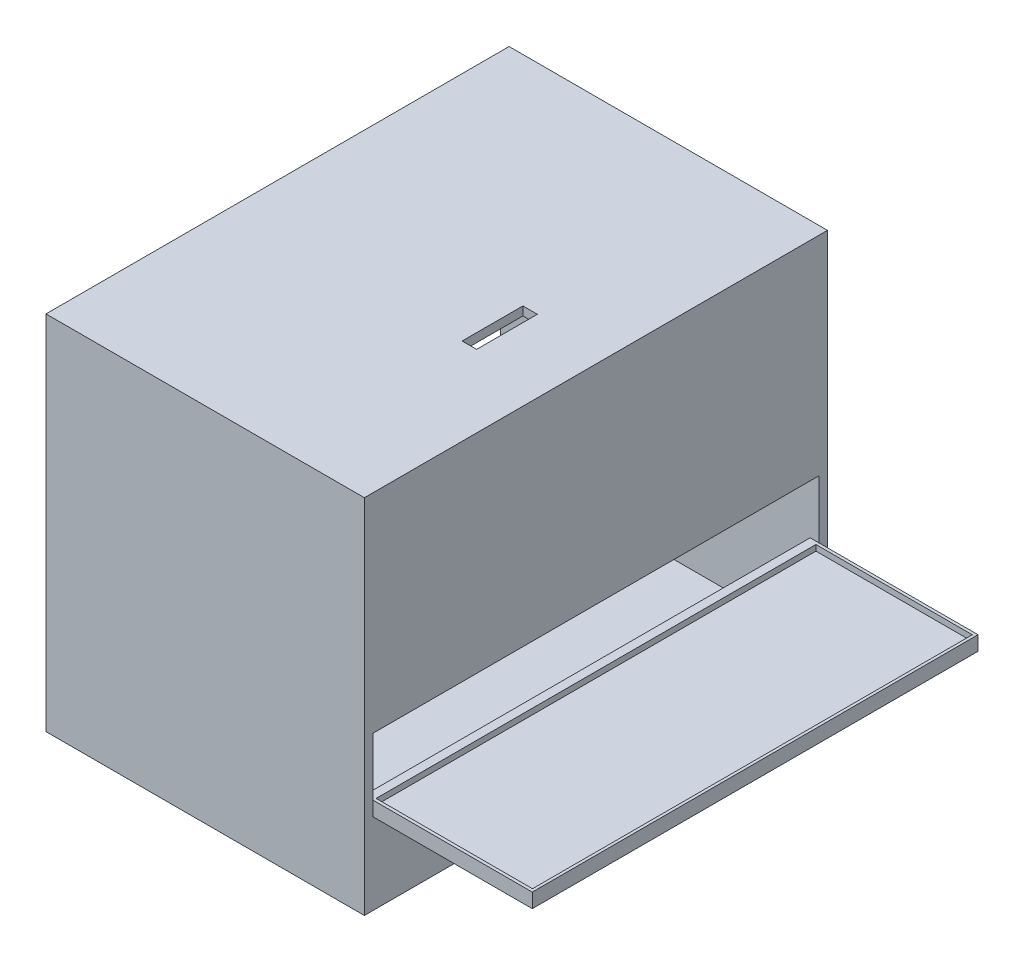
ISO-10303-21;
HEADER;
FILE_DESCRIPTION(('STEP AP214'),'2;1');
FILE_NAME('part.step','',(''),(''),'','','');
FILE_SCHEMA(('AUTOMOTIVE_DESIGN { 1 0 10303 214 1 1 1 1 }'));
ENDSEC;
DATA;
#1=APPLICATION_CONTEXT('core data for automotive mechanical design processes');
#2=APPLICATION_PROTOCOL_DEFINITION('international standard','automotive_design',2000,#1);
#3=PRODUCT_CONTEXT('',#1,'mechanical');
#4=PRODUCT('Part','Part','',(#3));
#5=PRODUCT_RELATED_PRODUCT_CATEGORY('part','',(#4));
#6=PRODUCT_DEFINITION_FORMATION('','',#4);
#7=PRODUCT_DEFINITION_CONTEXT('part definition',#1,'design');
#8=PRODUCT_DEFINITION('design','',#6,#7);
#9=PRODUCT_DEFINITION_SHAPE('','',#8);
#10=(LENGTH_UNIT() NAMED_UNIT(*) SI_UNIT(.MILLI.,.METRE.));
#11=(NAMED_UNIT(*) PLANE_ANGLE_UNIT() SI_UNIT($,.RADIAN.));
#12=(NAMED_UNIT(*) SI_UNIT($,.STERADIAN.) SOLID_ANGLE_UNIT());
#13=UNCERTAINTY_MEASURE_WITH_UNIT(LENGTH_MEASURE(1.E-05),#10,'distance_accuracy_value','');
#14=(GEOMETRIC_REPRESENTATION_CONTEXT(3) GLOBAL_UNCERTAINTY_ASSIGNED_CONTEXT((#13)) GLOBAL_UNIT_ASSIGNED_CONTEXT((#10,
#11,#12)) REPRESENTATION_CONTEXT('',''));
#15=CARTESIAN_POINT('',(0.,0.,0.));
#16=DIRECTION('',(0.,0.,1.));
#17=DIRECTION('',(1.,0.,0.));
#18=AXIS2_PLACEMENT_3D('',#15,#16,#17);
#19=CARTESIAN_POINT('',(110.,10.,-160.));
#20=DIRECTION('',(-1.,0.,0.));
#21=DIRECTION('',(0.,0.,1.));
#22=AXIS2_PLACEMENT_3D('',#19,#20,#21);
#23=PLANE('',#22);
#24=DIRECTION('',(0.,-1.,0.));
#25=VECTOR('',#24,1.);
#26=CARTESIAN_POINT('',(110.,10.,0.));
#27=LINE('',#26,#25);
#28=CARTESIAN_POINT('',(110.,130.,0.));
#29=VERTEX_POINT('',#28);
#30=CARTESIAN_POINT('',(110.,5.,0.));
#31=VERTEX_POINT('',#30);
#32=EDGE_CURVE('E424',#29,#31,#27,.T.);
#33=ORIENTED_EDGE('',*,*,#32,.T.);
#34=DIRECTION('',(0.,0.,1.));
#35=VECTOR('',#34,1.);
#36=CARTESIAN_POINT('',(110.,5.,0.));
#37=LINE('',#36,#35);
#38=CARTESIAN_POINT('',(110.,5.,-160.));
#39=VERTEX_POINT('',#38);
#40=EDGE_CURVE('E823',#39,#31,#37,.T.);
#41=ORIENTED_EDGE('',*,*,#40,.F.);
#42=DIRECTION('',(0.,-1.,0.));
#43=VECTOR('',#42,1.);
#44=CARTESIAN_POINT('',(110.,10.,-160.));
#45=LINE('',#44,#43);
#46=CARTESIAN_POINT('',(110.,130.,-160.));
#47=VERTEX_POINT('',#46);
#48=EDGE_CURVE('E420',#47,#39,#45,.T.);
#49=ORIENTED_EDGE('',*,*,#48,.F.);
#50=DIRECTION('',(0.,0.,-1.));
#51=VECTOR('',#50,1.);
#52=CARTESIAN_POINT('',(110.,130.,0.));
#53=LINE('',#52,#51);
#54=EDGE_CURVE('E357',#29,#47,#53,.T.);
#55=ORIENTED_EDGE('',*,*,#54,.F.);
#56=EDGE_LOOP('',(#33,#41,#49,#55));
#57=FACE_BOUND('',#56,.T.);
#58=DIRECTION('',(0.,1.,0.));
#59=VECTOR('',#58,1.);
#60=CARTESIAN_POINT('',(110.,58.0406305240899,-157.));
#61=LINE('',#60,#59);
#62=CARTESIAN_POINT('',(110.,38.0049075765783,-157.));
#63=VERTEX_POINT('',#62);
#64=CARTESIAN_POINT('',(110.,58.0406305240899,-157.));
#65=VERTEX_POINT('',#64);
#66=EDGE_CURVE('E265',#63,#65,#61,.T.);
#67=ORIENTED_EDGE('',*,*,#66,.F.);
#68=DIRECTION('',(0.,1.,0.));
#69=VECTOR('',#68,1.);
#70=CARTESIAN_POINT('',(110.,33.0313842492603,-157.));
#71=LINE('',#70,#69);
#72=CARTESIAN_POINT('',(110.,33.0313842492603,-157.));
#73=VERTEX_POINT('',#72);
#74=EDGE_CURVE('E234',#73,#63,#71,.T.);
#75=ORIENTED_EDGE('',*,*,#74,.F.);
#76=DIRECTION('',(0.,0.,-1.));
#77=VECTOR('',#76,1.);
#78=CARTESIAN_POINT('',(110.,33.0313842492603,-10.));
#79=LINE('',#78,#77);
#80=CARTESIAN_POINT('',(110.,33.0313842492603,-3.00000000000001));
#81=VERTEX_POINT('',#80);
#82=EDGE_CURVE('E898',#81,#73,#79,.T.);
#83=ORIENTED_EDGE('',*,*,#82,.F.);
#84=DIRECTION('',(0.,-1.,0.));
#85=VECTOR('',#84,1.);
#86=CARTESIAN_POINT('',(110.,36.0049075765782,-3.00000000000001));
#87=LINE('',#86,#85);
#88=CARTESIAN_POINT('',(110.,38.0049075765782,-3.00000000000001));
#89=VERTEX_POINT('',#88);
#90=EDGE_CURVE('E244',#89,#81,#87,.T.);
#91=ORIENTED_EDGE('',*,*,#90,.F.);
#92=DIRECTION('',(0.,-1.,0.));
#93=VECTOR('',#92,1.);
#94=CARTESIAN_POINT('',(110.,38.0049075765782,-3.00000000000002));
#95=LINE('',#94,#93);
#96=CARTESIAN_POINT('',(110.,58.0406305240899,-3.00000000000002));
#97=VERTEX_POINT('',#96);
#98=EDGE_CURVE('E843',#97,#89,#95,.T.);
#99=ORIENTED_EDGE('',*,*,#98,.F.);
#100=DIRECTION('',(0.,0.,-1.));
#101=VECTOR('',#100,1.);
#102=CARTESIAN_POINT('',(110.,58.0406305240899,-160.));
#103=LINE('',#102,#101);
#104=EDGE_CURVE('E273',#97,#65,#103,.T.);
#105=ORIENTED_EDGE('',*,*,#104,.T.);
#106=EDGE_LOOP('',(#67,#75,#83,#91,#99,#105));
#107=FACE_BOUND('',#106,.T.);
#108=ADVANCED_FACE('F41',(#57,#107),#23,.F.);
#109=DIRECTION('',(0.,-1.,0.));
#110=VECTOR('',#109,1.);
#111=CARTESIAN_POINT('',(110.,38.0049075765783,-156.007066327625));
#112=LINE('',#111,#110);
#113=CARTESIAN_POINT('',(110.,38.0049075765783,-156.007066327625));
#114=VERTEX_POINT('',#113);
#115=CARTESIAN_POINT('',(110.,36.0049075765783,-156.007066327625));
#116=VERTEX_POINT('',#115);
#117=EDGE_CURVE('E919',#114,#116,#112,.T.);
#118=ORIENTED_EDGE('',*,*,#117,.F.);
#119=DIRECTION('',(0.,0.,1.));
#120=VECTOR('',#119,1.);
#121=CARTESIAN_POINT('',(110.,38.0049075765783,-150.));
#122=LINE('',#121,#120);
#123=CARTESIAN_POINT('',(110.,38.0049075765782,-4.05001981175701));
#124=VERTEX_POINT('',#123);
#125=EDGE_CURVE('E361',#114,#124,#122,.T.);
#126=ORIENTED_EDGE('',*,*,#125,.T.);
#127=DIRECTION('',(0.,-1.,0.));
#128=VECTOR('',#127,1.);
#129=CARTESIAN_POINT('',(110.,38.0049075765782,-4.05001981175701));
#130=LINE('',#129,#128);
#131=CARTESIAN_POINT('',(110.,36.0049075765782,-4.05001981175701));
#132=VERTEX_POINT('',#131);
#133=EDGE_CURVE('E930',#124,#132,#130,.T.);
#134=ORIENTED_EDGE('',*,*,#133,.T.);
#135=DIRECTION('',(0.,0.,1.));
#136=VECTOR('',#135,1.);
#137=CARTESIAN_POINT('',(110.,36.0049075765783,-150.));
#138=LINE('',#137,#136);
#139=EDGE_CURVE('E362',#116,#132,#138,.T.);
#140=ORIENTED_EDGE('',*,*,#139,.F.);
#141=EDGE_LOOP('',(#118,#126,#134,#140));
#142=FACE_BOUND('',#141,.T.);
#143=ADVANCED_FACE('F463',(#142),#23,.F.);
#144=CARTESIAN_POINT('',(0.,36.0049075765782,0.));
#145=DIRECTION('',(0.,1.,0.));
#146=DIRECTION('',(0.,0.,1.));
#147=AXIS2_PLACEMENT_3D('',#144,#145,#146);
#148=PLANE('',#147);
#149=DIRECTION('',(0.,0.,1.));
#150=VECTOR('',#149,1.);
#151=CARTESIAN_POINT('',(164.030852529379,36.0049075765783,-156.007066327625));
#152=LINE('',#151,#150);
#153=CARTESIAN_POINT('',(164.030852529379,36.0049075765783,-156.007066327625));
#154=VERTEX_POINT('',#153);
#155=CARTESIAN_POINT('',(164.030852529379,36.0049075765782,-4.05001981175701));
#156=VERTEX_POINT('',#155);
#157=EDGE_CURVE('E936',#154,#156,#152,.T.);
#158=ORIENTED_EDGE('',*,*,#157,.F.);
#159=DIRECTION('',(1.,0.,0.));
#160=VECTOR('',#159,1.);
#161=CARTESIAN_POINT('',(110.,36.0049075765783,-156.007066327625));
#162=LINE('',#161,#160);
#163=EDGE_CURVE('E939',#116,#154,#162,.T.);
#164=ORIENTED_EDGE('',*,*,#163,.F.);
#165=ORIENTED_EDGE('',*,*,#139,.T.);
#166=DIRECTION('',(-1.,0.,0.));
#167=VECTOR('',#166,1.);
#168=CARTESIAN_POINT('',(164.030852529379,36.0049075765782,-4.05001981175701));
#169=LINE('',#168,#167);
#170=EDGE_CURVE('E258',#156,#132,#169,.T.);
#171=ORIENTED_EDGE('',*,*,#170,.F.);
#172=EDGE_LOOP('',(#158,#164,#165,#171));
#173=FACE_BOUND('',#172,.T.);
#174=ADVANCED_FACE('F468',(#173),#148,.T.);
#175=CARTESIAN_POINT('',(165.,0.,0.));
#176=DIRECTION('',(1.,0.,0.));
#177=DIRECTION('',(0.,0.,-1.));
#178=AXIS2_PLACEMENT_3D('',#175,#176,#177);
#179=PLANE('',#178);
#180=DIRECTION('',(0.,-1.,0.));
#181=VECTOR('',#180,1.);
#182=CARTESIAN_POINT('',(165.,36.0049075765783,-157.));
#183=LINE('',#182,#181);
#184=CARTESIAN_POINT('',(165.,38.0049075765783,-157.));
#185=VERTEX_POINT('',#184);
#186=CARTESIAN_POINT('',(165.,33.0313842492603,-157.));
#187=VERTEX_POINT('',#186);
#188=EDGE_CURVE('E916',#185,#187,#183,.T.);
#189=ORIENTED_EDGE('',*,*,#188,.F.);
#190=DIRECTION('',(0.,0.,-1.));
#191=VECTOR('',#190,1.);
#192=CARTESIAN_POINT('',(165.,38.0049075765782,-3.00000000000001));
#193=LINE('',#192,#191);
#194=CARTESIAN_POINT('',(165.,38.0049075765782,-3.00000000000001));
#195=VERTEX_POINT('',#194);
#196=EDGE_CURVE('E255',#195,#185,#193,.T.);
#197=ORIENTED_EDGE('',*,*,#196,.F.);
#198=DIRECTION('',(0.,1.,0.));
#199=VECTOR('',#198,1.);
#200=CARTESIAN_POINT('',(165.,33.0313842492603,-3.00000000000001));
#201=LINE('',#200,#199);
#202=CARTESIAN_POINT('',(165.,33.0313842492603,-3.00000000000001));
#203=VERTEX_POINT('',#202);
#204=EDGE_CURVE('E904',#203,#195,#201,.T.);
#205=ORIENTED_EDGE('',*,*,#204,.F.);
#206=DIRECTION('',(0.,0.,1.));
#207=VECTOR('',#206,1.);
#208=CARTESIAN_POINT('',(165.,33.0313842492603,-150.));
#209=LINE('',#208,#207);
#210=EDGE_CURVE('E901',#187,#203,#209,.T.);
#211=ORIENTED_EDGE('',*,*,#210,.F.);
#212=EDGE_LOOP('',(#189,#197,#205,#211));
#213=FACE_BOUND('',#212,.T.);
#214=ADVANCED_FACE('F504',(#213),#179,.T.);
#215=CARTESIAN_POINT('',(132.5,38.0049075765782,-10.));
#216=DIRECTION('',(0.,-1.,0.));
#217=DIRECTION('',(0.,0.,-1.));
#218=AXIS2_PLACEMENT_3D('',#215,#216,#217);
#219=PLANE('',#218);
#220=ORIENTED_EDGE('',*,*,#125,.F.);
#221=DIRECTION('',(1.,0.,0.));
#222=VECTOR('',#221,1.);
#223=CARTESIAN_POINT('',(110.,38.0049075765783,-156.007066327625));
#224=LINE('',#223,#222);
#225=CARTESIAN_POINT('',(164.030852529379,38.0049075765783,-156.007066327625));
#226=VERTEX_POINT('',#225);
#227=EDGE_CURVE('E257',#114,#226,#224,.T.);
#228=ORIENTED_EDGE('',*,*,#227,.T.);
#229=DIRECTION('',(0.,0.,1.));
#230=VECTOR('',#229,1.);
#231=CARTESIAN_POINT('',(164.030852529379,38.0049075765783,-156.007066327625));
#232=LINE('',#231,#230);
#233=CARTESIAN_POINT('',(164.030852529379,38.0049075765782,-4.05001981175701));
#234=VERTEX_POINT('',#233);
#235=EDGE_CURVE('E950',#226,#234,#232,.T.);
#236=ORIENTED_EDGE('',*,*,#235,.T.);
#237=DIRECTION('',(-1.,0.,0.));
#238=VECTOR('',#237,1.);
#239=CARTESIAN_POINT('',(164.030852529379,38.0049075765782,-4.05001981175701));
#240=LINE('',#239,#238);
#241=EDGE_CURVE('E947',#234,#124,#240,.T.);
#242=ORIENTED_EDGE('',*,*,#241,.T.);
#243=EDGE_LOOP('',(#220,#228,#236,#242));
#244=FACE_BOUND('',#243,.T.);
#245=DIRECTION('',(0.,0.,-1.));
#246=VECTOR('',#245,1.);
#247=CARTESIAN_POINT('',(107.,38.0049075765782,-10.));
#248=LINE('',#247,#246);
#249=CARTESIAN_POINT('',(107.,38.0049075765782,-3.00000000000002));
#250=VERTEX_POINT('',#249);
#251=CARTESIAN_POINT('',(107.,38.0049075765783,-157.));
#252=VERTEX_POINT('',#251);
#253=EDGE_CURVE('E815',#250,#252,#248,.T.);
#254=ORIENTED_EDGE('',*,*,#253,.F.);
#255=DIRECTION('',(-1.,0.,0.));
#256=VECTOR('',#255,1.);
#257=CARTESIAN_POINT('',(102.5,38.0049075765782,-3.00000000000002));
#258=LINE('',#257,#256);
#259=EDGE_CURVE('E847',#89,#250,#258,.T.);
#260=ORIENTED_EDGE('',*,*,#259,.F.);
#261=DIRECTION('',(1.,0.,0.));
#262=VECTOR('',#261,1.);
#263=CARTESIAN_POINT('',(110.,38.0049075765782,-3.00000000000001));
#264=LINE('',#263,#262);
#265=EDGE_CURVE('E944',#89,#195,#264,.T.);
#266=ORIENTED_EDGE('',*,*,#265,.T.);
#267=ORIENTED_EDGE('',*,*,#196,.T.);
#268=DIRECTION('',(-1.,0.,0.));
#269=VECTOR('',#268,1.);
#270=CARTESIAN_POINT('',(165.,38.0049075765783,-157.));
#271=LINE('',#270,#269);
#272=EDGE_CURVE('E238',#185,#63,#271,.T.);
#273=ORIENTED_EDGE('',*,*,#272,.T.);
#274=DIRECTION('',(1.,0.,0.));
#275=VECTOR('',#274,1.);
#276=CARTESIAN_POINT('',(110.,38.0049075765783,-157.));
#277=LINE('',#276,#275);
#278=EDGE_CURVE('E252',#252,#63,#277,.T.);
#279=ORIENTED_EDGE('',*,*,#278,.F.);
#280=EDGE_LOOP('',(#254,#260,#266,#267,#273,#279));
#281=FACE_BOUND('',#280,.T.);
#282=ADVANCED_FACE('F251',(#244,#281),#219,.F.);
#283=CARTESIAN_POINT('',(132.5,58.0406305240899,-150.));
#284=DIRECTION('',(0.,1.,0.));
#285=DIRECTION('',(0.,0.,1.));
#286=AXIS2_PLACEMENT_3D('',#283,#284,#285);
#287=PLANE('',#286);
#288=DIRECTION('',(0.,0.,1.));
#289=VECTOR('',#288,1.);
#290=CARTESIAN_POINT('',(107.,58.0406305240899,-150.));
#291=LINE('',#290,#289);
#292=CARTESIAN_POINT('',(107.,58.0406305240899,-157.));
#293=VERTEX_POINT('',#292);
#294=CARTESIAN_POINT('',(107.,58.0406305240899,-3.00000000000002));
#295=VERTEX_POINT('',#294);
#296=EDGE_CURVE('E824',#293,#295,#291,.T.);
#297=ORIENTED_EDGE('',*,*,#296,.F.);
#298=DIRECTION('',(-1.,0.,0.));
#299=VECTOR('',#298,1.);
#300=CARTESIAN_POINT('',(102.5,58.0406305240899,-157.));
#301=LINE('',#300,#299);
#302=EDGE_CURVE('E276',#65,#293,#301,.T.);
#303=ORIENTED_EDGE('',*,*,#302,.F.);
#304=ORIENTED_EDGE('',*,*,#104,.F.);
#305=DIRECTION('',(1.,0.,0.));
#306=VECTOR('',#305,1.);
#307=CARTESIAN_POINT('',(110.,58.0406305240899,-3.00000000000002));
#308=LINE('',#307,#306);
#309=EDGE_CURVE('E840',#295,#97,#308,.T.);
#310=ORIENTED_EDGE('',*,*,#309,.F.);
#311=EDGE_LOOP('',(#297,#303,#304,#310));
#312=FACE_BOUND('',#311,.T.);
#313=ADVANCED_FACE('F451',(#312),#287,.F.);
#314=CARTESIAN_POINT('',(85.,121.,-84.7635613183249));
#315=DIRECTION('',(1.,0.,0.));
#316=DIRECTION('',(0.,0.,-1.));
#317=AXIS2_PLACEMENT_3D('',#314,#315,#316);
#318=PLANE('',#317);
#319=DIRECTION('',(0.,0.,-1.));
#320=VECTOR('',#319,1.);
#321=CARTESIAN_POINT('',(85.,127.,-84.7635613183249));
#322=LINE('',#321,#320);
#323=CARTESIAN_POINT('',(85.,127.,-63.7635613183249));
#324=VERTEX_POINT('',#323);
#325=CARTESIAN_POINT('',(85.,127.,-84.7635613183249));
#326=VERTEX_POINT('',#325);
#327=EDGE_CURVE('E65',#324,#326,#322,.T.);
#328=ORIENTED_EDGE('',*,*,#327,.F.);
#329=DIRECTION('',(0.,1.,0.));
#330=VECTOR('',#329,1.);
#331=CARTESIAN_POINT('',(85.,121.,-63.7635613183249));
#332=LINE('',#331,#330);
#333=CARTESIAN_POINT('',(85.,130.,-63.7635613183249));
#334=VERTEX_POINT('',#333);
#335=EDGE_CURVE('E334',#324,#334,#332,.T.);
#336=ORIENTED_EDGE('',*,*,#335,.T.);
#337=DIRECTION('',(0.,0.,-1.));
#338=VECTOR('',#337,1.);
#339=CARTESIAN_POINT('',(85.,130.,-84.7635613183249));
#340=LINE('',#339,#338);
#341=CARTESIAN_POINT('',(85.,130.,-84.7635613183249));
#342=VERTEX_POINT('',#341);
#343=EDGE_CURVE('E317',#334,#342,#340,.T.);
#344=ORIENTED_EDGE('',*,*,#343,.T.);
#345=DIRECTION('',(0.,1.,0.));
#346=VECTOR('',#345,1.);
#347=CARTESIAN_POINT('',(85.,121.,-84.7635613183249));
#348=LINE('',#347,#346);
#349=EDGE_CURVE('E333',#326,#342,#348,.T.);
#350=ORIENTED_EDGE('',*,*,#349,.F.);
#351=EDGE_LOOP('',(#328,#336,#344,#350));
#352=FACE_BOUND('',#351,.T.);
#353=ADVANCED_FACE('F449',(#352),#318,.F.);
#354=CARTESIAN_POINT('',(85.,121.,-63.7635613183249));
#355=DIRECTION('',(0.,0.,1.));
#356=DIRECTION('',(1.,0.,0.));
#357=AXIS2_PLACEMENT_3D('',#354,#355,#356);
#358=PLANE('',#357);
#359=DIRECTION('',(1.,0.,0.));
#360=VECTOR('',#359,1.);
#361=CARTESIAN_POINT('',(85.,127.,-63.7635613183249));
#362=LINE('',#361,#360);
#363=CARTESIAN_POINT('',(80.,127.,-63.7635613183249));
#364=VERTEX_POINT('',#363);
#365=EDGE_CURVE('E312',#364,#324,#362,.T.);
#366=ORIENTED_EDGE('',*,*,#365,.F.);
#367=DIRECTION('',(0.,1.,0.));
#368=VECTOR('',#367,1.);
#369=CARTESIAN_POINT('',(80.,121.,-63.7635613183249));
#370=LINE('',#369,#368);
#371=CARTESIAN_POINT('',(80.,130.,-63.7635613183249));
#372=VERTEX_POINT('',#371);
#373=EDGE_CURVE('E338',#364,#372,#370,.T.);
#374=ORIENTED_EDGE('',*,*,#373,.T.);
#375=DIRECTION('',(1.,0.,0.));
#376=VECTOR('',#375,1.);
#377=CARTESIAN_POINT('',(85.,130.,-63.7635613183249));
#378=LINE('',#377,#376);
#379=EDGE_CURVE('E329',#372,#334,#378,.T.);
#380=ORIENTED_EDGE('',*,*,#379,.T.);
#381=ORIENTED_EDGE('',*,*,#335,.F.);
#382=EDGE_LOOP('',(#366,#374,#380,#381));
#383=FACE_BOUND('',#382,.T.);
#384=ADVANCED_FACE('F447',(#383),#358,.F.);
#385=CARTESIAN_POINT('',(80.,121.,-63.7635613183249));
#386=DIRECTION('',(-1.,0.,0.));
#387=DIRECTION('',(0.,0.,1.));
#388=AXIS2_PLACEMENT_3D('',#385,#386,#387);
#389=PLANE('',#388);
#390=DIRECTION('',(0.,0.,1.));
#391=VECTOR('',#390,1.);
#392=CARTESIAN_POINT('',(80.,127.,-63.7635613183249));
#393=LINE('',#392,#391);
#394=CARTESIAN_POINT('',(80.,127.,-84.7635613183249));
#395=VERTEX_POINT('',#394);
#396=EDGE_CURVE('E309',#395,#364,#393,.T.);
#397=ORIENTED_EDGE('',*,*,#396,.F.);
#398=DIRECTION('',(0.,1.,0.));
#399=VECTOR('',#398,1.);
#400=CARTESIAN_POINT('',(80.,121.,-84.7635613183249));
#401=LINE('',#400,#399);
#402=CARTESIAN_POINT('',(80.,130.,-84.7635613183249));
#403=VERTEX_POINT('',#402);
#404=EDGE_CURVE('E341',#395,#403,#401,.T.);
#405=ORIENTED_EDGE('',*,*,#404,.T.);
#406=DIRECTION('',(0.,0.,1.));
#407=VECTOR('',#406,1.);
#408=CARTESIAN_POINT('',(80.,130.,-63.7635613183249));
#409=LINE('',#408,#407);
#410=EDGE_CURVE('E325',#403,#372,#409,.T.);
#411=ORIENTED_EDGE('',*,*,#410,.T.);
#412=ORIENTED_EDGE('',*,*,#373,.F.);
#413=EDGE_LOOP('',(#397,#405,#411,#412));
#414=FACE_BOUND('',#413,.T.);
#415=ADVANCED_FACE('F436',(#414),#389,.F.);
#416=CARTESIAN_POINT('',(80.,121.,-84.7635613183249));
#417=DIRECTION('',(0.,0.,-1.));
#418=DIRECTION('',(-1.,0.,0.));
#419=AXIS2_PLACEMENT_3D('',#416,#417,#418);
#420=PLANE('',#419);
#421=DIRECTION('',(-1.,0.,0.));
#422=VECTOR('',#421,1.);
#423=CARTESIAN_POINT('',(80.,127.,-84.7635613183249));
#424=LINE('',#423,#422);
#425=EDGE_CURVE('E50',#326,#395,#424,.T.);
#426=ORIENTED_EDGE('',*,*,#425,.F.);
#427=ORIENTED_EDGE('',*,*,#349,.T.);
#428=DIRECTION('',(-1.,0.,0.));
#429=VECTOR('',#428,1.);
#430=CARTESIAN_POINT('',(80.,130.,-84.7635613183249));
#431=LINE('',#430,#429);
#432=EDGE_CURVE('E321',#342,#403,#431,.T.);
#433=ORIENTED_EDGE('',*,*,#432,.T.);
#434=ORIENTED_EDGE('',*,*,#404,.F.);
#435=EDGE_LOOP('',(#426,#427,#433,#434));
#436=FACE_BOUND('',#435,.T.);
#437=ADVANCED_FACE('F437',(#436),#420,.F.);
#438=CARTESIAN_POINT('',(0.,10.,0.));
#439=DIRECTION('',(0.,-1.,0.));
#440=DIRECTION('',(0.,0.,-1.));
#441=AXIS2_PLACEMENT_3D('',#438,#439,#440);
#442=PLANE('',#441);
#443=DIRECTION('',(0.,0.,1.));
#444=VECTOR('',#443,1.);
#445=CARTESIAN_POINT('',(0.,10.,0.));
#446=LINE('',#445,#444);
#447=CARTESIAN_POINT('',(0.,10.,-157.));
#448=VERTEX_POINT('',#447);
#449=CARTESIAN_POINT('',(0.,10.,-3.));
#450=VERTEX_POINT('',#449);
#451=EDGE_CURVE('E407',#448,#450,#446,.T.);
#452=ORIENTED_EDGE('',*,*,#451,.T.);
#453=DIRECTION('',(-1.,0.,0.));
#454=VECTOR('',#453,1.);
#455=CARTESIAN_POINT('',(0.,10.,-3.));
#456=LINE('',#455,#454);
#457=CARTESIAN_POINT('',(7.50000000000001,10.,-3.00000000000001));
#458=VERTEX_POINT('',#457);
#459=EDGE_CURVE('E858',#458,#450,#456,.T.);
#460=ORIENTED_EDGE('',*,*,#459,.F.);
#461=DIRECTION('',(0.,0.,1.));
#462=VECTOR('',#461,1.);
#463=CARTESIAN_POINT('',(7.5,10.,-150.));
#464=LINE('',#463,#462);
#465=CARTESIAN_POINT('',(7.5,10.,-157.));
#466=VERTEX_POINT('',#465);
#467=EDGE_CURVE('E392',#466,#458,#464,.T.);
#468=ORIENTED_EDGE('',*,*,#467,.F.);
#469=DIRECTION('',(1.,0.,0.));
#470=VECTOR('',#469,1.);
#471=CARTESIAN_POINT('',(7.5,10.,-157.));
#472=LINE('',#471,#470);
#473=EDGE_CURVE('E290',#448,#466,#472,.T.);
#474=ORIENTED_EDGE('',*,*,#473,.F.);
#475=EDGE_LOOP('',(#452,#460,#468,#474));
#476=FACE_BOUND('',#475,.T.);
#477=ADVANCED_FACE('F480',(#476),#442,.F.);
#478=CARTESIAN_POINT('',(110.,10.,0.));
#479=DIRECTION('',(0.,0.,-1.));
#480=DIRECTION('',(-1.,0.,0.));
#481=AXIS2_PLACEMENT_3D('',#478,#479,#480);
#482=PLANE('',#481);
#483=DIRECTION('',(0.,-1.,0.));
#484=VECTOR('',#483,1.);
#485=CARTESIAN_POINT('',(0.,10.,0.));
#486=LINE('',#485,#484);
#487=CARTESIAN_POINT('',(0.,130.,0.));
#488=VERTEX_POINT('',#487);
#489=CARTESIAN_POINT('',(0.,5.,0.));
#490=VERTEX_POINT('',#489);
#491=EDGE_CURVE('E412',#488,#490,#486,.T.);
#492=ORIENTED_EDGE('',*,*,#491,.T.);
#493=DIRECTION('',(-1.,0.,0.));
#494=VECTOR('',#493,1.);
#495=CARTESIAN_POINT('',(0.,5.,0.));
#496=LINE('',#495,#494);
#497=EDGE_CURVE('E57',#31,#490,#496,.T.);
#498=ORIENTED_EDGE('',*,*,#497,.F.);
#499=ORIENTED_EDGE('',*,*,#32,.F.);
#500=DIRECTION('',(1.,0.,0.));
#501=VECTOR('',#500,1.);
#502=CARTESIAN_POINT('',(0.,130.,0.));
#503=LINE('',#502,#501);
#504=EDGE_CURVE('E353',#488,#29,#503,.T.);
#505=ORIENTED_EDGE('',*,*,#504,.F.);
#506=EDGE_LOOP('',(#492,#498,#499,#505));
#507=FACE_BOUND('',#506,.T.);
#508=ADVANCED_FACE('F43',(#507),#482,.F.);
#509=CARTESIAN_POINT('',(0.,10.,-160.));
#510=DIRECTION('',(0.,0.,1.));
#511=DIRECTION('',(1.,0.,0.));
#512=AXIS2_PLACEMENT_3D('',#509,#510,#511);
#513=PLANE('',#512);
#514=DIRECTION('',(0.,-1.,0.));
#515=VECTOR('',#514,1.);
#516=CARTESIAN_POINT('',(32.5189069026237,8.,-160.));
#517=LINE('',#516,#515);
#518=CARTESIAN_POINT('',(32.5189069026237,28.,-160.));
#519=VERTEX_POINT('',#518);
#520=CARTESIAN_POINT('',(32.5189069026237,8.,-160.));
#521=VERTEX_POINT('',#520);
#522=EDGE_CURVE('E383',#519,#521,#517,.T.);
#523=ORIENTED_EDGE('',*,*,#522,.T.);
#524=DIRECTION('',(1.,0.,0.));
#525=VECTOR('',#524,1.);
#526=CARTESIAN_POINT('',(57.5224838599269,8.,-160.));
#527=LINE('',#526,#525);
#528=CARTESIAN_POINT('',(57.5224838599269,8.,-160.));
#529=VERTEX_POINT('',#528);
#530=EDGE_CURVE('E371',#521,#529,#527,.T.);
#531=ORIENTED_EDGE('',*,*,#530,.T.);
#532=DIRECTION('',(0.,1.,0.));
#533=VECTOR('',#532,1.);
#534=CARTESIAN_POINT('',(57.5224838599269,28.,-160.));
#535=LINE('',#534,#533);
#536=CARTESIAN_POINT('',(57.5224838599269,28.,-160.));
#537=VERTEX_POINT('',#536);
#538=EDGE_CURVE('E375',#529,#537,#535,.T.);
#539=ORIENTED_EDGE('',*,*,#538,.T.);
#540=DIRECTION('',(-1.,0.,0.));
#541=VECTOR('',#540,1.);
#542=CARTESIAN_POINT('',(32.5189069026237,28.,-160.));
#543=LINE('',#542,#541);
#544=EDGE_CURVE('E379',#537,#519,#543,.T.);
#545=ORIENTED_EDGE('',*,*,#544,.T.);
#546=EDGE_LOOP('',(#523,#531,#539,#545));
#547=FACE_BOUND('',#546,.T.);
#548=ORIENTED_EDGE('',*,*,#48,.T.);
#549=DIRECTION('',(1.,0.,0.));
#550=VECTOR('',#549,1.);
#551=CARTESIAN_POINT('',(110.,5.,-160.));
#552=LINE('',#551,#550);
#553=CARTESIAN_POINT('',(0.,5.,-160.));
#554=VERTEX_POINT('',#553);
#555=EDGE_CURVE('E837',#554,#39,#552,.T.);
#556=ORIENTED_EDGE('',*,*,#555,.F.);
#557=DIRECTION('',(0.,-1.,0.));
#558=VECTOR('',#557,1.);
#559=CARTESIAN_POINT('',(0.,10.,-160.));
#560=LINE('',#559,#558);
#561=CARTESIAN_POINT('',(0.,130.,-160.));
#562=VERTEX_POINT('',#561);
#563=EDGE_CURVE('E416',#562,#554,#560,.T.);
#564=ORIENTED_EDGE('',*,*,#563,.F.);
#565=DIRECTION('',(-1.,0.,0.));
#566=VECTOR('',#565,1.);
#567=CARTESIAN_POINT('',(110.,130.,-160.));
#568=LINE('',#567,#566);
#569=EDGE_CURVE('E337',#47,#562,#568,.T.);
#570=ORIENTED_EDGE('',*,*,#569,.F.);
#571=EDGE_LOOP('',(#548,#556,#564,#570));
#572=FACE_BOUND('',#571,.T.);
#573=ADVANCED_FACE('F471',(#547,#572),#513,.F.);
#574=CARTESIAN_POINT('',(0.,10.,0.));
#575=DIRECTION('',(1.,0.,0.));
#576=DIRECTION('',(0.,0.,-1.));
#577=AXIS2_PLACEMENT_3D('',#574,#575,#576);
#578=PLANE('',#577);
#579=DIRECTION('',(0.,0.,-1.));
#580=VECTOR('',#579,1.);
#581=CARTESIAN_POINT('',(0.,127.,-10.));
#582=LINE('',#581,#580);
#583=CARTESIAN_POINT('',(0.,127.,-3.));
#584=VERTEX_POINT('',#583);
#585=CARTESIAN_POINT('',(0.,127.,-157.));
#586=VERTEX_POINT('',#585);
#587=EDGE_CURVE('E306',#584,#586,#582,.T.);
#588=ORIENTED_EDGE('',*,*,#587,.F.);
#589=DIRECTION('',(0.,1.,0.));
#590=VECTOR('',#589,1.);
#591=CARTESIAN_POINT('',(0.,127.,-3.));
#592=LINE('',#591,#590);
#593=EDGE_CURVE('E862',#450,#584,#592,.T.);
#594=ORIENTED_EDGE('',*,*,#593,.F.);
#595=ORIENTED_EDGE('',*,*,#451,.F.);
#596=DIRECTION('',(0.,-1.,0.));
#597=VECTOR('',#596,1.);
#598=CARTESIAN_POINT('',(0.,10.,-157.));
#599=LINE('',#598,#597);
#600=EDGE_CURVE('E286',#586,#448,#599,.T.);
#601=ORIENTED_EDGE('',*,*,#600,.F.);
#602=EDGE_LOOP('',(#588,#594,#595,#601));
#603=FACE_BOUND('',#602,.T.);
#604=ORIENTED_EDGE('',*,*,#563,.T.);
#605=DIRECTION('',(0.,0.,-1.));
#606=VECTOR('',#605,1.);
#607=CARTESIAN_POINT('',(0.,5.,-160.));
#608=LINE('',#607,#606);
#609=EDGE_CURVE('E834',#490,#554,#608,.T.);
#610=ORIENTED_EDGE('',*,*,#609,.F.);
#611=ORIENTED_EDGE('',*,*,#491,.F.);
#612=DIRECTION('',(0.,0.,1.));
#613=VECTOR('',#612,1.);
#614=CARTESIAN_POINT('',(0.,130.,-160.));
#615=LINE('',#614,#613);
#616=EDGE_CURVE('E349',#562,#488,#615,.T.);
#617=ORIENTED_EDGE('',*,*,#616,.F.);
#618=EDGE_LOOP('',(#604,#610,#611,#617));
#619=FACE_BOUND('',#618,.T.);
#620=ADVANCED_FACE('F474',(#603,#619),#578,.F.);
#621=CARTESIAN_POINT('',(7.5,8.,-150.));
#622=DIRECTION('',(-1.,0.,0.));
#623=DIRECTION('',(0.,0.,1.));
#624=AXIS2_PLACEMENT_3D('',#621,#622,#623);
#625=PLANE('',#624);
#626=ORIENTED_EDGE('',*,*,#467,.T.);
#627=DIRECTION('',(0.,1.,0.));
#628=VECTOR('',#627,1.);
#629=CARTESIAN_POINT('',(7.50000000000001,10.,-3.00000000000001));
#630=LINE('',#629,#628);
#631=CARTESIAN_POINT('',(7.5,8.,-3.00000000000001));
#632=VERTEX_POINT('',#631);
#633=EDGE_CURVE('E854',#632,#458,#630,.T.);
#634=ORIENTED_EDGE('',*,*,#633,.F.);
#635=DIRECTION('',(0.,0.,1.));
#636=VECTOR('',#635,1.);
#637=CARTESIAN_POINT('',(7.5,8.,-150.));
#638=LINE('',#637,#636);
#639=CARTESIAN_POINT('',(7.5,8.,-157.));
#640=VERTEX_POINT('',#639);
#641=EDGE_CURVE('E404',#640,#632,#638,.T.);
#642=ORIENTED_EDGE('',*,*,#641,.F.);
#643=DIRECTION('',(0.,-1.,0.));
#644=VECTOR('',#643,1.);
#645=CARTESIAN_POINT('',(7.5,8.,-157.));
#646=LINE('',#645,#644);
#647=EDGE_CURVE('E294',#466,#640,#646,.T.);
#648=ORIENTED_EDGE('',*,*,#647,.F.);
#649=EDGE_LOOP('',(#626,#634,#642,#648));
#650=FACE_BOUND('',#649,.T.);
#651=ADVANCED_FACE('F478',(#650),#625,.F.);
#652=CARTESIAN_POINT('',(0.,8.,0.));
#653=DIRECTION('',(0.,1.,0.));
#654=DIRECTION('',(0.,0.,1.));
#655=AXIS2_PLACEMENT_3D('',#652,#653,#654);
#656=PLANE('',#655);
#657=DIRECTION('',(0.,0.,1.));
#658=VECTOR('',#657,1.);
#659=CARTESIAN_POINT('',(32.5189069026237,8.,-160.));
#660=LINE('',#659,#658);
#661=CARTESIAN_POINT('',(32.5189069026237,8.,-157.));
#662=VERTEX_POINT('',#661);
#663=EDGE_CURVE('E388',#521,#662,#660,.T.);
#664=ORIENTED_EDGE('',*,*,#663,.T.);
#665=DIRECTION('',(1.,0.,0.));
#666=VECTOR('',#665,1.);
#667=CARTESIAN_POINT('',(102.5,8.,-157.));
#668=LINE('',#667,#666);
#669=EDGE_CURVE('E269',#640,#662,#668,.T.);
#670=ORIENTED_EDGE('',*,*,#669,.F.);
#671=ORIENTED_EDGE('',*,*,#641,.T.);
#672=DIRECTION('',(-1.,0.,0.));
#673=VECTOR('',#672,1.);
#674=CARTESIAN_POINT('',(7.5,8.,-3.00000000000001));
#675=LINE('',#674,#673);
#676=CARTESIAN_POINT('',(107.,8.,-3.00000000000002));
#677=VERTEX_POINT('',#676);
#678=EDGE_CURVE('E850',#677,#632,#675,.T.);
#679=ORIENTED_EDGE('',*,*,#678,.F.);
#680=DIRECTION('',(0.,0.,1.));
#681=VECTOR('',#680,1.);
#682=CARTESIAN_POINT('',(107.,8.,-157.));
#683=LINE('',#682,#681);
#684=CARTESIAN_POINT('',(107.,8.,-157.));
#685=VERTEX_POINT('',#684);
#686=EDGE_CURVE('E875',#685,#677,#683,.T.);
#687=ORIENTED_EDGE('',*,*,#686,.F.);
#688=CARTESIAN_POINT('',(57.5224838599269,8.,-157.));
#689=VERTEX_POINT('',#688);
#690=EDGE_CURVE('E868',#689,#685,#668,.T.);
#691=ORIENTED_EDGE('',*,*,#690,.F.);
#692=DIRECTION('',(0.,0.,1.));
#693=VECTOR('',#692,1.);
#694=CARTESIAN_POINT('',(57.5224838599269,8.,-160.));
#695=LINE('',#694,#693);
#696=EDGE_CURVE('E387',#529,#689,#695,.T.);
#697=ORIENTED_EDGE('',*,*,#696,.F.);
#698=ORIENTED_EDGE('',*,*,#530,.F.);
#699=EDGE_LOOP('',(#664,#670,#671,#679,#687,#691,#697,#698));
#700=FACE_BOUND('',#699,.T.);
#701=ADVANCED_FACE('F486',(#700),#656,.T.);
#702=CARTESIAN_POINT('',(32.5189069026237,8.,-160.));
#703=DIRECTION('',(-1.,0.,0.));
#704=DIRECTION('',(0.,0.,1.));
#705=AXIS2_PLACEMENT_3D('',#702,#703,#704);
#706=PLANE('',#705);
#707=DIRECTION('',(0.,0.,1.));
#708=VECTOR('',#707,1.);
#709=CARTESIAN_POINT('',(32.5189069026237,28.,-160.));
#710=LINE('',#709,#708);
#711=CARTESIAN_POINT('',(32.5189069026237,28.,-157.));
#712=VERTEX_POINT('',#711);
#713=EDGE_CURVE('E393',#519,#712,#710,.T.);
#714=ORIENTED_EDGE('',*,*,#713,.T.);
#715=DIRECTION('',(0.,-1.,0.));
#716=VECTOR('',#715,1.);
#717=CARTESIAN_POINT('',(32.5189069026237,8.,-157.));
#718=LINE('',#717,#716);
#719=EDGE_CURVE('E302',#712,#662,#718,.T.);
#720=ORIENTED_EDGE('',*,*,#719,.T.);
#721=ORIENTED_EDGE('',*,*,#663,.F.);
#722=ORIENTED_EDGE('',*,*,#522,.F.);
#723=EDGE_LOOP('',(#714,#720,#721,#722));
#724=FACE_BOUND('',#723,.T.);
#725=ADVANCED_FACE('F490',(#724),#706,.F.);
#726=CARTESIAN_POINT('',(32.5189069026237,28.,-160.));
#727=DIRECTION('',(0.,1.,0.));
#728=DIRECTION('',(0.,0.,1.));
#729=AXIS2_PLACEMENT_3D('',#726,#727,#728);
#730=PLANE('',#729);
#731=DIRECTION('',(0.,0.,1.));
#732=VECTOR('',#731,1.);
#733=CARTESIAN_POINT('',(57.5224838599269,28.,-160.));
#734=LINE('',#733,#732);
#735=CARTESIAN_POINT('',(57.5224838599269,28.,-157.));
#736=VERTEX_POINT('',#735);
#737=EDGE_CURVE('E397',#537,#736,#734,.T.);
#738=ORIENTED_EDGE('',*,*,#737,.T.);
#739=DIRECTION('',(-1.,0.,0.));
#740=VECTOR('',#739,1.);
#741=CARTESIAN_POINT('',(32.5189069026237,28.,-157.));
#742=LINE('',#741,#740);
#743=EDGE_CURVE('E298',#736,#712,#742,.T.);
#744=ORIENTED_EDGE('',*,*,#743,.T.);
#745=ORIENTED_EDGE('',*,*,#713,.F.);
#746=ORIENTED_EDGE('',*,*,#544,.F.);
#747=EDGE_LOOP('',(#738,#744,#745,#746));
#748=FACE_BOUND('',#747,.T.);
#749=ADVANCED_FACE('F495',(#748),#730,.F.);
#750=CARTESIAN_POINT('',(57.5224838599269,28.,-160.));
#751=DIRECTION('',(1.,0.,0.));
#752=DIRECTION('',(0.,0.,-1.));
#753=AXIS2_PLACEMENT_3D('',#750,#751,#752);
#754=PLANE('',#753);
#755=ORIENTED_EDGE('',*,*,#696,.T.);
#756=DIRECTION('',(0.,1.,0.));
#757=VECTOR('',#756,1.);
#758=CARTESIAN_POINT('',(57.5224838599269,28.,-157.));
#759=LINE('',#758,#757);
#760=EDGE_CURVE('E11',#689,#736,#759,.T.);
#761=ORIENTED_EDGE('',*,*,#760,.T.);
#762=ORIENTED_EDGE('',*,*,#737,.F.);
#763=ORIENTED_EDGE('',*,*,#538,.F.);
#764=EDGE_LOOP('',(#755,#761,#762,#763));
#765=FACE_BOUND('',#764,.T.);
#766=ADVANCED_FACE('F492',(#765),#754,.F.);
#767=CARTESIAN_POINT('',(0.,130.,0.));
#768=DIRECTION('',(0.,1.,0.));
#769=DIRECTION('',(0.,0.,1.));
#770=AXIS2_PLACEMENT_3D('',#767,#768,#769);
#771=PLANE('',#770);
#772=ORIENTED_EDGE('',*,*,#343,.F.);
#773=ORIENTED_EDGE('',*,*,#379,.F.);
#774=ORIENTED_EDGE('',*,*,#410,.F.);
#775=ORIENTED_EDGE('',*,*,#432,.F.);
#776=EDGE_LOOP('',(#772,#773,#774,#775));
#777=FACE_BOUND('',#776,.T.);
#778=ORIENTED_EDGE('',*,*,#569,.T.);
#779=ORIENTED_EDGE('',*,*,#616,.T.);
#780=ORIENTED_EDGE('',*,*,#504,.T.);
#781=ORIENTED_EDGE('',*,*,#54,.T.);
#782=EDGE_LOOP('',(#778,#779,#780,#781));
#783=FACE_BOUND('',#782,.T.);
#784=ADVANCED_FACE('F443',(#777,#783),#771,.T.);
#785=CARTESIAN_POINT('',(0.,127.,0.));
#786=DIRECTION('',(0.,-1.,0.));
#787=DIRECTION('',(0.,0.,-1.));
#788=AXIS2_PLACEMENT_3D('',#785,#786,#787);
#789=PLANE('',#788);
#790=ORIENTED_EDGE('',*,*,#587,.T.);
#791=DIRECTION('',(-1.,0.,0.));
#792=VECTOR('',#791,1.);
#793=CARTESIAN_POINT('',(0.,127.,-157.));
#794=LINE('',#793,#792);
#795=CARTESIAN_POINT('',(107.,127.,-157.));
#796=VERTEX_POINT('',#795);
#797=EDGE_CURVE('E279',#796,#586,#794,.T.);
#798=ORIENTED_EDGE('',*,*,#797,.F.);
#799=DIRECTION('',(0.,0.,-1.));
#800=VECTOR('',#799,1.);
#801=CARTESIAN_POINT('',(107.,127.,-3.00000000000002));
#802=LINE('',#801,#800);
#803=CARTESIAN_POINT('',(107.,127.,-3.00000000000002));
#804=VERTEX_POINT('',#803);
#805=EDGE_CURVE('E894',#804,#796,#802,.T.);
#806=ORIENTED_EDGE('',*,*,#805,.F.);
#807=DIRECTION('',(1.,0.,0.));
#808=VECTOR('',#807,1.);
#809=CARTESIAN_POINT('',(102.5,127.,-3.00000000000002));
#810=LINE('',#809,#808);
#811=EDGE_CURVE('E866',#584,#804,#810,.T.);
#812=ORIENTED_EDGE('',*,*,#811,.F.);
#813=EDGE_LOOP('',(#790,#798,#806,#812));
#814=FACE_BOUND('',#813,.T.);
#815=ORIENTED_EDGE('',*,*,#327,.T.);
#816=ORIENTED_EDGE('',*,*,#425,.T.);
#817=ORIENTED_EDGE('',*,*,#396,.T.);
#818=ORIENTED_EDGE('',*,*,#365,.T.);
#819=EDGE_LOOP('',(#815,#816,#817,#818));
#820=FACE_BOUND('',#819,.T.);
#821=ADVANCED_FACE('F429',(#814,#820),#789,.T.);
#822=CARTESIAN_POINT('',(0.,0.,-157.));
#823=DIRECTION('',(0.,0.,-1.));
#824=DIRECTION('',(-1.,0.,0.));
#825=AXIS2_PLACEMENT_3D('',#822,#823,#824);
#826=PLANE('',#825);
#827=DIRECTION('',(0.,-1.,0.));
#828=VECTOR('',#827,1.);
#829=CARTESIAN_POINT('',(107.,127.,-157.));
#830=LINE('',#829,#828);
#831=EDGE_CURVE('E267',#252,#685,#830,.T.);
#832=ORIENTED_EDGE('',*,*,#831,.F.);
#833=ORIENTED_EDGE('',*,*,#278,.T.);
#834=ORIENTED_EDGE('',*,*,#66,.T.);
#835=ORIENTED_EDGE('',*,*,#302,.T.);
#836=EDGE_CURVE('E886',#796,#293,#830,.T.);
#837=ORIENTED_EDGE('',*,*,#836,.F.);
#838=ORIENTED_EDGE('',*,*,#797,.T.);
#839=ORIENTED_EDGE('',*,*,#600,.T.);
#840=ORIENTED_EDGE('',*,*,#473,.T.);
#841=ORIENTED_EDGE('',*,*,#647,.T.);
#842=ORIENTED_EDGE('',*,*,#669,.T.);
#843=ORIENTED_EDGE('',*,*,#719,.F.);
#844=ORIENTED_EDGE('',*,*,#743,.F.);
#845=ORIENTED_EDGE('',*,*,#760,.F.);
#846=ORIENTED_EDGE('',*,*,#690,.T.);
#847=EDGE_LOOP('',(#832,#833,#834,#835,#837,#838,#839,#840,#841,#842,#843,#844,#845,#846));
#848=FACE_BOUND('',#847,.T.);
#849=ADVANCED_FACE('F263',(#848),#826,.F.);
#850=CARTESIAN_POINT('',(0.,0.,-3.));
#851=DIRECTION('',(0.,0.,1.));
#852=DIRECTION('',(1.,0.,0.));
#853=AXIS2_PLACEMENT_3D('',#850,#851,#852);
#854=PLANE('',#853);
#855=DIRECTION('',(0.,1.,0.));
#856=VECTOR('',#855,1.);
#857=CARTESIAN_POINT('',(107.,8.,-3.00000000000002));
#858=LINE('',#857,#856);
#859=EDGE_CURVE('E885',#295,#804,#858,.T.);
#860=ORIENTED_EDGE('',*,*,#859,.F.);
#861=ORIENTED_EDGE('',*,*,#309,.T.);
#862=ORIENTED_EDGE('',*,*,#98,.T.);
#863=ORIENTED_EDGE('',*,*,#259,.T.);
#864=EDGE_CURVE('E819',#677,#250,#858,.T.);
#865=ORIENTED_EDGE('',*,*,#864,.F.);
#866=ORIENTED_EDGE('',*,*,#678,.T.);
#867=ORIENTED_EDGE('',*,*,#633,.T.);
#868=ORIENTED_EDGE('',*,*,#459,.T.);
#869=ORIENTED_EDGE('',*,*,#593,.T.);
#870=ORIENTED_EDGE('',*,*,#811,.T.);
#871=EDGE_LOOP('',(#860,#861,#862,#863,#865,#866,#867,#868,#869,#870));
#872=FACE_BOUND('',#871,.T.);
#873=ADVANCED_FACE('F521',(#872),#854,.F.);
#874=CARTESIAN_POINT('',(0.,5.,0.));
#875=DIRECTION('',(0.,1.,0.));
#876=DIRECTION('',(0.,0.,1.));
#877=AXIS2_PLACEMENT_3D('',#874,#875,#876);
#878=PLANE('',#877);
#879=ORIENTED_EDGE('',*,*,#40,.T.);
#880=ORIENTED_EDGE('',*,*,#497,.T.);
#881=ORIENTED_EDGE('',*,*,#609,.T.);
#882=ORIENTED_EDGE('',*,*,#555,.T.);
#883=EDGE_LOOP('',(#879,#880,#881,#882));
#884=FACE_BOUND('',#883,.T.);
#885=ADVANCED_FACE('F664',(#884),#878,.F.);
#886=CARTESIAN_POINT('',(107.,0.,0.));
#887=DIRECTION('',(-1.,0.,0.));
#888=DIRECTION('',(0.,0.,1.));
#889=AXIS2_PLACEMENT_3D('',#886,#887,#888);
#890=PLANE('',#889);
#891=ORIENTED_EDGE('',*,*,#253,.T.);
#892=ORIENTED_EDGE('',*,*,#831,.T.);
#893=ORIENTED_EDGE('',*,*,#686,.T.);
#894=ORIENTED_EDGE('',*,*,#864,.T.);
#895=EDGE_LOOP('',(#891,#892,#893,#894));
#896=FACE_BOUND('',#895,.T.);
#897=ADVANCED_FACE('F674',(#896),#890,.T.);
#898=ORIENTED_EDGE('',*,*,#296,.T.);
#899=ORIENTED_EDGE('',*,*,#859,.T.);
#900=ORIENTED_EDGE('',*,*,#805,.T.);
#901=ORIENTED_EDGE('',*,*,#836,.T.);
#902=EDGE_LOOP('',(#898,#899,#900,#901));
#903=FACE_BOUND('',#902,.T.);
#904=ADVANCED_FACE('F771',(#903),#890,.T.);
#905=CARTESIAN_POINT('',(0.,33.0313842492603,0.));
#906=DIRECTION('',(0.,-1.,0.));
#907=DIRECTION('',(0.,0.,-1.));
#908=AXIS2_PLACEMENT_3D('',#905,#906,#907);
#909=PLANE('',#908);
#910=ORIENTED_EDGE('',*,*,#210,.T.);
#911=DIRECTION('',(1.,0.,0.));
#912=VECTOR('',#911,1.);
#913=CARTESIAN_POINT('',(110.,33.0313842492603,-3.00000000000001));
#914=LINE('',#913,#912);
#915=EDGE_CURVE('E907',#81,#203,#914,.T.);
#916=ORIENTED_EDGE('',*,*,#915,.F.);
#917=ORIENTED_EDGE('',*,*,#82,.T.);
#918=DIRECTION('',(-1.,0.,0.));
#919=VECTOR('',#918,1.);
#920=CARTESIAN_POINT('',(165.,33.0313842492603,-157.));
#921=LINE('',#920,#919);
#922=EDGE_CURVE('E240',#187,#73,#921,.T.);
#923=ORIENTED_EDGE('',*,*,#922,.F.);
#924=EDGE_LOOP('',(#910,#916,#917,#923));
#925=FACE_BOUND('',#924,.T.);
#926=ADVANCED_FACE('F717',(#925),#909,.T.);
#927=CARTESIAN_POINT('',(0.,0.,-3.00000000000001));
#928=DIRECTION('',(0.,0.,1.));
#929=DIRECTION('',(1.,0.,0.));
#930=AXIS2_PLACEMENT_3D('',#927,#928,#929);
#931=PLANE('',#930);
#932=ORIENTED_EDGE('',*,*,#204,.T.);
#933=ORIENTED_EDGE('',*,*,#265,.F.);
#934=ORIENTED_EDGE('',*,*,#90,.T.);
#935=ORIENTED_EDGE('',*,*,#915,.T.);
#936=EDGE_LOOP('',(#932,#933,#934,#935));
#937=FACE_BOUND('',#936,.T.);
#938=ADVANCED_FACE('F710',(#937),#931,.T.);
#939=CARTESIAN_POINT('',(0.,0.,-157.));
#940=DIRECTION('',(0.,0.,-1.));
#941=DIRECTION('',(-1.,0.,0.));
#942=AXIS2_PLACEMENT_3D('',#939,#940,#941);
#943=PLANE('',#942);
#944=ORIENTED_EDGE('',*,*,#74,.T.);
#945=ORIENTED_EDGE('',*,*,#272,.F.);
#946=ORIENTED_EDGE('',*,*,#188,.T.);
#947=ORIENTED_EDGE('',*,*,#922,.T.);
#948=EDGE_LOOP('',(#944,#945,#946,#947));
#949=FACE_BOUND('',#948,.T.);
#950=ADVANCED_FACE('F236',(#949),#943,.T.);
#951=CARTESIAN_POINT('',(110.,38.0049075765783,-156.007066327625));
#952=DIRECTION('',(0.,0.,-1.));
#953=DIRECTION('',(0.,1.,0.));
#954=AXIS2_PLACEMENT_3D('',#951,#952,#953);
#955=PLANE('',#954);
#956=ORIENTED_EDGE('',*,*,#163,.T.);
#957=DIRECTION('',(0.,-1.,0.));
#958=VECTOR('',#957,1.);
#959=CARTESIAN_POINT('',(164.030852529379,38.0049075765783,-156.007066327625));
#960=LINE('',#959,#958);
#961=EDGE_CURVE('E922',#226,#154,#960,.T.);
#962=ORIENTED_EDGE('',*,*,#961,.F.);
#963=ORIENTED_EDGE('',*,*,#227,.F.);
#964=ORIENTED_EDGE('',*,*,#117,.T.);
#965=EDGE_LOOP('',(#956,#962,#963,#964));
#966=FACE_BOUND('',#965,.T.);
#967=ADVANCED_FACE('F730',(#966),#955,.F.);
#968=CARTESIAN_POINT('',(164.030852529379,38.0049075765783,-156.007066327625));
#969=DIRECTION('',(1.,0.,0.));
#970=DIRECTION('',(0.,1.,0.));
#971=AXIS2_PLACEMENT_3D('',#968,#969,#970);
#972=PLANE('',#971);
#973=ORIENTED_EDGE('',*,*,#157,.T.);
#974=DIRECTION('',(0.,-1.,0.));
#975=VECTOR('',#974,1.);
#976=CARTESIAN_POINT('',(164.030852529379,38.0049075765782,-4.05001981175701));
#977=LINE('',#976,#975);
#978=EDGE_CURVE('E926',#234,#156,#977,.T.);
#979=ORIENTED_EDGE('',*,*,#978,.F.);
#980=ORIENTED_EDGE('',*,*,#235,.F.);
#981=ORIENTED_EDGE('',*,*,#961,.T.);
#982=EDGE_LOOP('',(#973,#979,#980,#981));
#983=FACE_BOUND('',#982,.T.);
#984=ADVANCED_FACE('F742',(#983),#972,.F.);
#985=CARTESIAN_POINT('',(164.030852529379,38.0049075765782,-4.05001981175701));
#986=DIRECTION('',(0.,0.,1.));
#987=DIRECTION('',(0.,-1.,0.));
#988=AXIS2_PLACEMENT_3D('',#985,#986,#987);
#989=PLANE('',#988);
#990=ORIENTED_EDGE('',*,*,#170,.T.);
#991=ORIENTED_EDGE('',*,*,#133,.F.);
#992=ORIENTED_EDGE('',*,*,#241,.F.);
#993=ORIENTED_EDGE('',*,*,#978,.T.);
#994=EDGE_LOOP('',(#990,#991,#992,#993));
#995=FACE_BOUND('',#994,.T.);
#996=ADVANCED_FACE('F751',(#995),#989,.F.);
#997=CLOSED_SHELL('',(#108,#143,#174,#214,#282,#313,#353,#384,#415,#437,#477,#508,#573,#620,
#651,#701,#725,#749,#766,#784,#821,#849,#873,#885,#897,#904,#926,#938,#950,#967,#984,#996));
#998=MANIFOLD_SOLID_BREP('B2',#997);
#999=ADVANCED_BREP_SHAPE_REPRESENTATION('',(#18,#998),#14);
#1000=SHAPE_DEFINITION_REPRESENTATION(#9,#999);
ENDSEC;
END-ISO-10303-21;
